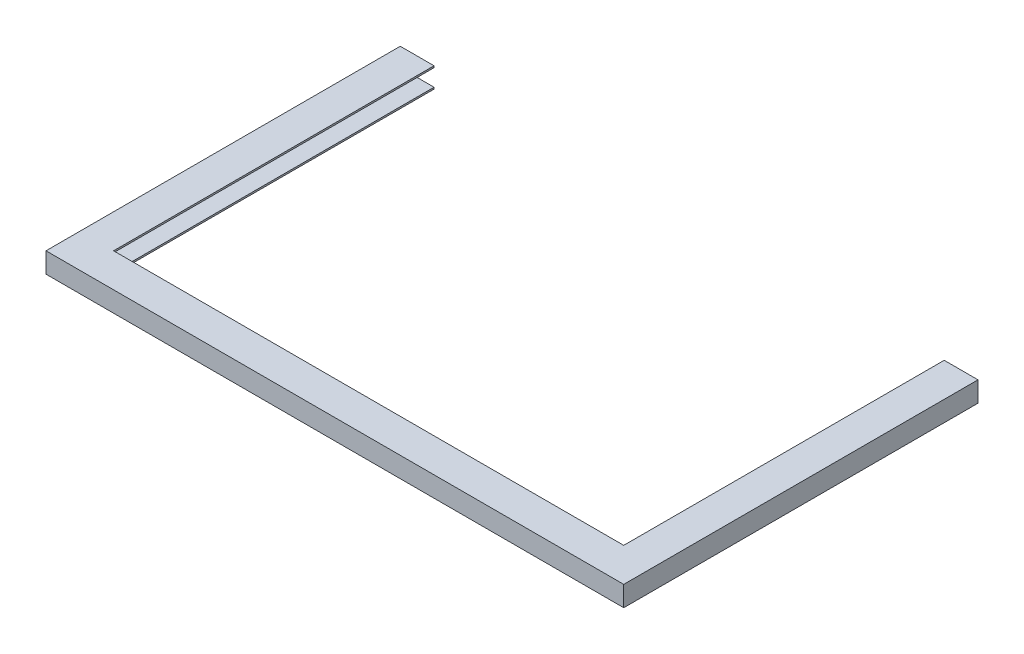
ISO-10303-21;
HEADER;
FILE_DESCRIPTION(('STEP AP214'),'2;1');
FILE_NAME('part.step','',(''),(''),'','','');
FILE_SCHEMA(('AUTOMOTIVE_DESIGN { 1 0 10303 214 1 1 1 1 }'));
ENDSEC;
DATA;
#1=APPLICATION_CONTEXT('core data for automotive mechanical design processes');
#2=APPLICATION_PROTOCOL_DEFINITION('international standard','automotive_design',2000,#1);
#3=PRODUCT_CONTEXT('',#1,'mechanical');
#4=PRODUCT('Part','Part','',(#3));
#5=PRODUCT_RELATED_PRODUCT_CATEGORY('part','',(#4));
#6=PRODUCT_DEFINITION_FORMATION('','',#4);
#7=PRODUCT_DEFINITION_CONTEXT('part definition',#1,'design');
#8=PRODUCT_DEFINITION('design','',#6,#7);
#9=PRODUCT_DEFINITION_SHAPE('','',#8);
#10=(LENGTH_UNIT() NAMED_UNIT(*) SI_UNIT(.MILLI.,.METRE.));
#11=(NAMED_UNIT(*) PLANE_ANGLE_UNIT() SI_UNIT($,.RADIAN.));
#12=(NAMED_UNIT(*) SI_UNIT($,.STERADIAN.) SOLID_ANGLE_UNIT());
#13=UNCERTAINTY_MEASURE_WITH_UNIT(LENGTH_MEASURE(1.E-05),#10,'distance_accuracy_value','');
#14=(GEOMETRIC_REPRESENTATION_CONTEXT(3) GLOBAL_UNCERTAINTY_ASSIGNED_CONTEXT((#13)) GLOBAL_UNIT_ASSIGNED_CONTEXT((#10,
#11,#12)) REPRESENTATION_CONTEXT('',''));
#15=CARTESIAN_POINT('',(0.,0.,0.));
#16=DIRECTION('',(0.,0.,1.));
#17=DIRECTION('',(1.,0.,0.));
#18=AXIS2_PLACEMENT_3D('',#15,#16,#17);
#19=CARTESIAN_POINT('',(0.,12.,-199.71239488283));
#20=DIRECTION('',(0.,0.,-1.));
#21=DIRECTION('',(-1.,0.,0.));
#22=AXIS2_PLACEMENT_3D('',#19,#20,#21);
#23=PLANE('',#22);
#24=DIRECTION('',(0.,1.,0.));
#25=VECTOR('',#24,1.);
#26=CARTESIAN_POINT('',(170.,0.999999999999971,-199.71239488283));
#27=LINE('',#26,#25);
#28=CARTESIAN_POINT('',(170.,0.999999999999971,-199.71239488283));
#29=VERTEX_POINT('',#28);
#30=CARTESIAN_POINT('',(170.,11.,-199.71239488283));
#31=VERTEX_POINT('',#30);
#32=EDGE_CURVE('E254',#29,#31,#27,.T.);
#33=ORIENTED_EDGE('',*,*,#32,.T.);
#34=DIRECTION('',(-1.,0.,0.));
#35=VECTOR('',#34,1.);
#36=CARTESIAN_POINT('',(170.,11.,-199.71239488283));
#37=LINE('',#36,#35);
#38=CARTESIAN_POINT('',(151.,11.,-199.71239488283));
#39=VERTEX_POINT('',#38);
#40=EDGE_CURVE('E252',#31,#39,#37,.T.);
#41=ORIENTED_EDGE('',*,*,#40,.T.);
#42=DIRECTION('',(0.,-1.,0.));
#43=VECTOR('',#42,1.);
#44=CARTESIAN_POINT('',(151.,12.,-199.71239488283));
#45=LINE('',#44,#43);
#46=CARTESIAN_POINT('',(151.,12.,-199.71239488283));
#47=VERTEX_POINT('',#46);
#48=EDGE_CURVE('E182',#47,#39,#45,.T.);
#49=ORIENTED_EDGE('',*,*,#48,.F.);
#50=DIRECTION('',(1.,0.,0.));
#51=VECTOR('',#50,1.);
#52=CARTESIAN_POINT('',(0.,12.,-199.71239488283));
#53=LINE('',#52,#51);
#54=CARTESIAN_POINT('',(171.,12.,-199.71239488283));
#55=VERTEX_POINT('',#54);
#56=EDGE_CURVE('E217',#47,#55,#53,.T.);
#57=ORIENTED_EDGE('',*,*,#56,.T.);
#58=DIRECTION('',(0.,-1.,0.));
#59=VECTOR('',#58,1.);
#60=CARTESIAN_POINT('',(171.,12.,-199.71239488283));
#61=LINE('',#60,#59);
#62=CARTESIAN_POINT('',(171.,0.,-199.71239488283));
#63=VERTEX_POINT('',#62);
#64=EDGE_CURVE('E185',#55,#63,#61,.T.);
#65=ORIENTED_EDGE('',*,*,#64,.T.);
#66=DIRECTION('',(1.,0.,0.));
#67=VECTOR('',#66,1.);
#68=CARTESIAN_POINT('',(0.,0.,-199.71239488283));
#69=LINE('',#68,#67);
#70=CARTESIAN_POINT('',(151.,0.,-199.71239488283));
#71=VERTEX_POINT('',#70);
#72=EDGE_CURVE('E155',#71,#63,#69,.T.);
#73=ORIENTED_EDGE('',*,*,#72,.F.);
#74=CARTESIAN_POINT('',(151.,0.999999999999971,-199.71239488283));
#75=VERTEX_POINT('',#74);
#76=EDGE_CURVE('E181',#75,#71,#45,.T.);
#77=ORIENTED_EDGE('',*,*,#76,.F.);
#78=DIRECTION('',(-1.,0.,0.));
#79=VECTOR('',#78,1.);
#80=CARTESIAN_POINT('',(170.,0.999999999999971,-199.71239488283));
#81=LINE('',#80,#79);
#82=EDGE_CURVE('E247',#29,#75,#81,.T.);
#83=ORIENTED_EDGE('',*,*,#82,.F.);
#84=EDGE_LOOP('',(#33,#41,#49,#57,#65,#73,#77,#83));
#85=FACE_BOUND('',#84,.T.);
#86=ADVANCED_FACE('F33',(#85),#23,.T.);
#87=CARTESIAN_POINT('',(151.,12.,0.));
#88=DIRECTION('',(1.,0.,0.));
#89=DIRECTION('',(0.,0.,-1.));
#90=AXIS2_PLACEMENT_3D('',#87,#88,#89);
#91=PLANE('',#90);
#92=DIRECTION('',(0.,0.,-1.));
#93=VECTOR('',#92,1.);
#94=CARTESIAN_POINT('',(151.,11.,0.));
#95=LINE('',#94,#93);
#96=CARTESIAN_POINT('',(151.,11.,-10.));
#97=VERTEX_POINT('',#96);
#98=EDGE_CURVE('E152',#97,#39,#95,.T.);
#99=ORIENTED_EDGE('',*,*,#98,.F.);
#100=DIRECTION('',(0.,-1.,0.));
#101=VECTOR('',#100,1.);
#102=CARTESIAN_POINT('',(151.,12.,-10.));
#103=LINE('',#102,#101);
#104=CARTESIAN_POINT('',(151.,12.,-10.));
#105=VERTEX_POINT('',#104);
#106=EDGE_CURVE('E178',#105,#97,#103,.T.);
#107=ORIENTED_EDGE('',*,*,#106,.F.);
#108=DIRECTION('',(0.,0.,1.));
#109=VECTOR('',#108,1.);
#110=CARTESIAN_POINT('',(151.,12.,0.));
#111=LINE('',#110,#109);
#112=EDGE_CURVE('E144',#47,#105,#111,.T.);
#113=ORIENTED_EDGE('',*,*,#112,.F.);
#114=ORIENTED_EDGE('',*,*,#48,.T.);
#115=EDGE_LOOP('',(#99,#107,#113,#114));
#116=FACE_BOUND('',#115,.T.);
#117=ADVANCED_FACE('F292',(#116),#91,.F.);
#118=CARTESIAN_POINT('',(0.,12.,-10.));
#119=DIRECTION('',(0.,0.,-1.));
#120=DIRECTION('',(-1.,0.,0.));
#121=AXIS2_PLACEMENT_3D('',#118,#119,#120);
#122=PLANE('',#121);
#123=ORIENTED_EDGE('',*,*,#106,.T.);
#124=DIRECTION('',(-1.,0.,0.));
#125=VECTOR('',#124,1.);
#126=CARTESIAN_POINT('',(0.,11.,-10.));
#127=LINE('',#126,#125);
#128=CARTESIAN_POINT('',(-151.,11.,-10.));
#129=VERTEX_POINT('',#128);
#130=EDGE_CURVE('E225',#97,#129,#127,.T.);
#131=ORIENTED_EDGE('',*,*,#130,.T.);
#132=DIRECTION('',(0.,-1.,0.));
#133=VECTOR('',#132,1.);
#134=CARTESIAN_POINT('',(-151.,12.,-10.));
#135=LINE('',#134,#133);
#136=CARTESIAN_POINT('',(-151.,12.,-10.));
#137=VERTEX_POINT('',#136);
#138=EDGE_CURVE('E175',#137,#129,#135,.T.);
#139=ORIENTED_EDGE('',*,*,#138,.F.);
#140=DIRECTION('',(1.,0.,0.));
#141=VECTOR('',#140,1.);
#142=CARTESIAN_POINT('',(0.,12.,-10.));
#143=LINE('',#142,#141);
#144=EDGE_CURVE('E142',#137,#105,#143,.T.);
#145=ORIENTED_EDGE('',*,*,#144,.T.);
#146=EDGE_LOOP('',(#123,#131,#139,#145));
#147=FACE_BOUND('',#146,.T.);
#148=ADVANCED_FACE('F295',(#147),#122,.T.);
#149=CARTESIAN_POINT('',(-151.,12.,0.));
#150=DIRECTION('',(1.,0.,0.));
#151=DIRECTION('',(0.,0.,-1.));
#152=AXIS2_PLACEMENT_3D('',#149,#150,#151);
#153=PLANE('',#152);
#154=ORIENTED_EDGE('',*,*,#138,.T.);
#155=DIRECTION('',(0.,0.,-1.));
#156=VECTOR('',#155,1.);
#157=CARTESIAN_POINT('',(-151.,11.,0.));
#158=LINE('',#157,#156);
#159=CARTESIAN_POINT('',(-151.,11.,-199.71239488283));
#160=VERTEX_POINT('',#159);
#161=EDGE_CURVE('E124',#129,#160,#158,.T.);
#162=ORIENTED_EDGE('',*,*,#161,.T.);
#163=DIRECTION('',(0.,-1.,0.));
#164=VECTOR('',#163,1.);
#165=CARTESIAN_POINT('',(-151.,12.,-199.71239488283));
#166=LINE('',#165,#164);
#167=CARTESIAN_POINT('',(-151.,12.,-199.71239488283));
#168=VERTEX_POINT('',#167);
#169=EDGE_CURVE('E116',#168,#160,#166,.T.);
#170=ORIENTED_EDGE('',*,*,#169,.F.);
#171=DIRECTION('',(0.,0.,1.));
#172=VECTOR('',#171,1.);
#173=CARTESIAN_POINT('',(-151.,12.,0.));
#174=LINE('',#173,#172);
#175=EDGE_CURVE('E121',#168,#137,#174,.T.);
#176=ORIENTED_EDGE('',*,*,#175,.T.);
#177=EDGE_LOOP('',(#154,#162,#170,#176));
#178=FACE_BOUND('',#177,.T.);
#179=ADVANCED_FACE('F119',(#178),#153,.T.);
#180=CARTESIAN_POINT('',(0.,12.,-199.71239488283));
#181=DIRECTION('',(0.,0.,1.));
#182=DIRECTION('',(1.,0.,0.));
#183=AXIS2_PLACEMENT_3D('',#180,#181,#182);
#184=PLANE('',#183);
#185=DIRECTION('',(1.,0.,0.));
#186=VECTOR('',#185,1.);
#187=CARTESIAN_POINT('',(0.,11.,-199.71239488283));
#188=LINE('',#187,#186);
#189=CARTESIAN_POINT('',(-170.,11.,-199.71239488283));
#190=VERTEX_POINT('',#189);
#191=EDGE_CURVE('E11',#190,#160,#188,.T.);
#192=ORIENTED_EDGE('',*,*,#191,.F.);
#193=DIRECTION('',(0.,1.,0.));
#194=VECTOR('',#193,1.);
#195=CARTESIAN_POINT('',(-170.,0.999999999999971,-199.71239488283));
#196=LINE('',#195,#194);
#197=CARTESIAN_POINT('',(-170.,0.999999999999971,-199.71239488283));
#198=VERTEX_POINT('',#197);
#199=EDGE_CURVE('E193',#198,#190,#196,.T.);
#200=ORIENTED_EDGE('',*,*,#199,.F.);
#201=DIRECTION('',(1.,0.,0.));
#202=VECTOR('',#201,1.);
#203=CARTESIAN_POINT('',(0.,0.999999999999971,-199.71239488283));
#204=LINE('',#203,#202);
#205=CARTESIAN_POINT('',(-151.,0.999999999999971,-199.71239488283));
#206=VERTEX_POINT('',#205);
#207=EDGE_CURVE('E41',#198,#206,#204,.T.);
#208=ORIENTED_EDGE('',*,*,#207,.T.);
#209=CARTESIAN_POINT('',(-151.,0.,-199.71239488283));
#210=VERTEX_POINT('',#209);
#211=EDGE_CURVE('E128',#206,#210,#166,.T.);
#212=ORIENTED_EDGE('',*,*,#211,.T.);
#213=DIRECTION('',(-1.,0.,0.));
#214=VECTOR('',#213,1.);
#215=CARTESIAN_POINT('',(0.,0.,-199.71239488283));
#216=LINE('',#215,#214);
#217=CARTESIAN_POINT('',(-171.,0.,-199.71239488283));
#218=VERTEX_POINT('',#217);
#219=EDGE_CURVE('E167',#210,#218,#216,.T.);
#220=ORIENTED_EDGE('',*,*,#219,.T.);
#221=DIRECTION('',(0.,-1.,0.));
#222=VECTOR('',#221,1.);
#223=CARTESIAN_POINT('',(-171.,12.,-199.71239488283));
#224=LINE('',#223,#222);
#225=CARTESIAN_POINT('',(-171.,12.,-199.71239488283));
#226=VERTEX_POINT('',#225);
#227=EDGE_CURVE('E134',#226,#218,#224,.T.);
#228=ORIENTED_EDGE('',*,*,#227,.F.);
#229=DIRECTION('',(-1.,0.,0.));
#230=VECTOR('',#229,1.);
#231=CARTESIAN_POINT('',(0.,12.,-199.71239488283));
#232=LINE('',#231,#230);
#233=EDGE_CURVE('E131',#168,#226,#232,.T.);
#234=ORIENTED_EDGE('',*,*,#233,.F.);
#235=ORIENTED_EDGE('',*,*,#169,.T.);
#236=EDGE_LOOP('',(#192,#200,#208,#212,#220,#228,#234,#235));
#237=FACE_BOUND('',#236,.T.);
#238=ADVANCED_FACE('F132',(#237),#184,.F.);
#239=CARTESIAN_POINT('',(0.,12.,10.));
#240=DIRECTION('',(0.,0.,-1.));
#241=DIRECTION('',(-1.,0.,0.));
#242=AXIS2_PLACEMENT_3D('',#239,#240,#241);
#243=PLANE('',#242);
#244=DIRECTION('',(1.,0.,0.));
#245=VECTOR('',#244,1.);
#246=CARTESIAN_POINT('',(0.,0.,10.));
#247=LINE('',#246,#245);
#248=CARTESIAN_POINT('',(-171.,0.,10.));
#249=VERTEX_POINT('',#248);
#250=CARTESIAN_POINT('',(171.,0.,10.));
#251=VERTEX_POINT('',#250);
#252=EDGE_CURVE('E149',#249,#251,#247,.T.);
#253=ORIENTED_EDGE('',*,*,#252,.T.);
#254=DIRECTION('',(0.,-1.,0.));
#255=VECTOR('',#254,1.);
#256=CARTESIAN_POINT('',(171.,12.,10.));
#257=LINE('',#256,#255);
#258=CARTESIAN_POINT('',(171.,12.,10.));
#259=VERTEX_POINT('',#258);
#260=EDGE_CURVE('E187',#259,#251,#257,.T.);
#261=ORIENTED_EDGE('',*,*,#260,.F.);
#262=DIRECTION('',(1.,0.,0.));
#263=VECTOR('',#262,1.);
#264=CARTESIAN_POINT('',(0.,12.,10.));
#265=LINE('',#264,#263);
#266=CARTESIAN_POINT('',(-171.,12.,10.));
#267=VERTEX_POINT('',#266);
#268=EDGE_CURVE('E172',#267,#259,#265,.T.);
#269=ORIENTED_EDGE('',*,*,#268,.F.);
#270=DIRECTION('',(0.,-1.,0.));
#271=VECTOR('',#270,1.);
#272=CARTESIAN_POINT('',(-171.,12.,10.));
#273=LINE('',#272,#271);
#274=EDGE_CURVE('E57',#267,#249,#273,.T.);
#275=ORIENTED_EDGE('',*,*,#274,.T.);
#276=EDGE_LOOP('',(#253,#261,#269,#275));
#277=FACE_BOUND('',#276,.T.);
#278=ADVANCED_FACE('F35',(#277),#243,.F.);
#279=CARTESIAN_POINT('',(171.,12.,0.));
#280=DIRECTION('',(-1.,0.,0.));
#281=DIRECTION('',(0.,0.,1.));
#282=AXIS2_PLACEMENT_3D('',#279,#280,#281);
#283=PLANE('',#282);
#284=DIRECTION('',(0.,0.,-1.));
#285=VECTOR('',#284,1.);
#286=CARTESIAN_POINT('',(171.,0.,0.));
#287=LINE('',#286,#285);
#288=EDGE_CURVE('E151',#251,#63,#287,.T.);
#289=ORIENTED_EDGE('',*,*,#288,.T.);
#290=ORIENTED_EDGE('',*,*,#64,.F.);
#291=DIRECTION('',(0.,0.,-1.));
#292=VECTOR('',#291,1.);
#293=CARTESIAN_POINT('',(171.,12.,0.));
#294=LINE('',#293,#292);
#295=EDGE_CURVE('E97',#259,#55,#294,.T.);
#296=ORIENTED_EDGE('',*,*,#295,.F.);
#297=ORIENTED_EDGE('',*,*,#260,.T.);
#298=EDGE_LOOP('',(#289,#290,#296,#297));
#299=FACE_BOUND('',#298,.T.);
#300=ADVANCED_FACE('F209',(#299),#283,.F.);
#301=CARTESIAN_POINT('',(151.,0.999999999999971,-10.));
#302=VERTEX_POINT('',#301);
#303=CARTESIAN_POINT('',(151.,0.,-10.));
#304=VERTEX_POINT('',#303);
#305=EDGE_CURVE('E177',#302,#304,#103,.T.);
#306=ORIENTED_EDGE('',*,*,#305,.F.);
#307=DIRECTION('',(0.,0.,-1.));
#308=VECTOR('',#307,1.);
#309=CARTESIAN_POINT('',(151.,0.999999999999971,0.));
#310=LINE('',#309,#308);
#311=EDGE_CURVE('E229',#302,#75,#310,.T.);
#312=ORIENTED_EDGE('',*,*,#311,.T.);
#313=ORIENTED_EDGE('',*,*,#76,.T.);
#314=DIRECTION('',(0.,0.,1.));
#315=VECTOR('',#314,1.);
#316=CARTESIAN_POINT('',(151.,0.,0.));
#317=LINE('',#316,#315);
#318=EDGE_CURVE('E158',#71,#304,#317,.T.);
#319=ORIENTED_EDGE('',*,*,#318,.T.);
#320=EDGE_LOOP('',(#306,#312,#313,#319));
#321=FACE_BOUND('',#320,.T.);
#322=ADVANCED_FACE('F327',(#321),#91,.F.);
#323=DIRECTION('',(-1.,0.,0.));
#324=VECTOR('',#323,1.);
#325=CARTESIAN_POINT('',(0.,0.999999999999971,-10.));
#326=LINE('',#325,#324);
#327=CARTESIAN_POINT('',(-151.,0.999999999999971,-10.));
#328=VERTEX_POINT('',#327);
#329=EDGE_CURVE('E232',#302,#328,#326,.T.);
#330=ORIENTED_EDGE('',*,*,#329,.F.);
#331=ORIENTED_EDGE('',*,*,#305,.T.);
#332=DIRECTION('',(1.,0.,0.));
#333=VECTOR('',#332,1.);
#334=CARTESIAN_POINT('',(0.,0.,-10.));
#335=LINE('',#334,#333);
#336=CARTESIAN_POINT('',(-151.,0.,-10.));
#337=VERTEX_POINT('',#336);
#338=EDGE_CURVE('E161',#337,#304,#335,.T.);
#339=ORIENTED_EDGE('',*,*,#338,.F.);
#340=EDGE_CURVE('E127',#328,#337,#135,.T.);
#341=ORIENTED_EDGE('',*,*,#340,.F.);
#342=EDGE_LOOP('',(#330,#331,#339,#341));
#343=FACE_BOUND('',#342,.T.);
#344=ADVANCED_FACE('F334',(#343),#122,.T.);
#345=DIRECTION('',(0.,0.,-1.));
#346=VECTOR('',#345,1.);
#347=CARTESIAN_POINT('',(-151.,0.999999999999971,0.));
#348=LINE('',#347,#346);
#349=EDGE_CURVE('E48',#328,#206,#348,.T.);
#350=ORIENTED_EDGE('',*,*,#349,.F.);
#351=ORIENTED_EDGE('',*,*,#340,.T.);
#352=DIRECTION('',(0.,0.,1.));
#353=VECTOR('',#352,1.);
#354=CARTESIAN_POINT('',(-151.,0.,0.));
#355=LINE('',#354,#353);
#356=EDGE_CURVE('E164',#210,#337,#355,.T.);
#357=ORIENTED_EDGE('',*,*,#356,.F.);
#358=ORIENTED_EDGE('',*,*,#211,.F.);
#359=EDGE_LOOP('',(#350,#351,#357,#358));
#360=FACE_BOUND('',#359,.T.);
#361=ADVANCED_FACE('F198',(#360),#153,.T.);
#362=CARTESIAN_POINT('',(-171.,12.,0.));
#363=DIRECTION('',(-1.,0.,0.));
#364=DIRECTION('',(0.,0.,1.));
#365=AXIS2_PLACEMENT_3D('',#362,#363,#364);
#366=PLANE('',#365);
#367=DIRECTION('',(0.,0.,-1.));
#368=VECTOR('',#367,1.);
#369=CARTESIAN_POINT('',(-171.,0.,0.));
#370=LINE('',#369,#368);
#371=EDGE_CURVE('E169',#249,#218,#370,.T.);
#372=ORIENTED_EDGE('',*,*,#371,.F.);
#373=ORIENTED_EDGE('',*,*,#274,.F.);
#374=DIRECTION('',(0.,0.,-1.));
#375=VECTOR('',#374,1.);
#376=CARTESIAN_POINT('',(-171.,12.,0.));
#377=LINE('',#376,#375);
#378=EDGE_CURVE('E137',#267,#226,#377,.T.);
#379=ORIENTED_EDGE('',*,*,#378,.T.);
#380=ORIENTED_EDGE('',*,*,#227,.T.);
#381=EDGE_LOOP('',(#372,#373,#379,#380));
#382=FACE_BOUND('',#381,.T.);
#383=ADVANCED_FACE('F205',(#382),#366,.T.);
#384=CARTESIAN_POINT('',(0.,12.,0.));
#385=DIRECTION('',(0.,1.,0.));
#386=DIRECTION('',(0.,0.,1.));
#387=AXIS2_PLACEMENT_3D('',#384,#385,#386);
#388=PLANE('',#387);
#389=ORIENTED_EDGE('',*,*,#268,.T.);
#390=ORIENTED_EDGE('',*,*,#295,.T.);
#391=ORIENTED_EDGE('',*,*,#56,.F.);
#392=ORIENTED_EDGE('',*,*,#112,.T.);
#393=ORIENTED_EDGE('',*,*,#144,.F.);
#394=ORIENTED_EDGE('',*,*,#175,.F.);
#395=ORIENTED_EDGE('',*,*,#233,.T.);
#396=ORIENTED_EDGE('',*,*,#378,.F.);
#397=EDGE_LOOP('',(#389,#390,#391,#392,#393,#394,#395,#396));
#398=FACE_BOUND('',#397,.T.);
#399=ADVANCED_FACE('F140',(#398),#388,.T.);
#400=CARTESIAN_POINT('',(0.,0.,0.));
#401=DIRECTION('',(0.,1.,0.));
#402=DIRECTION('',(0.,0.,1.));
#403=AXIS2_PLACEMENT_3D('',#400,#401,#402);
#404=PLANE('',#403);
#405=ORIENTED_EDGE('',*,*,#252,.F.);
#406=ORIENTED_EDGE('',*,*,#371,.T.);
#407=ORIENTED_EDGE('',*,*,#219,.F.);
#408=ORIENTED_EDGE('',*,*,#356,.T.);
#409=ORIENTED_EDGE('',*,*,#338,.T.);
#410=ORIENTED_EDGE('',*,*,#318,.F.);
#411=ORIENTED_EDGE('',*,*,#72,.T.);
#412=ORIENTED_EDGE('',*,*,#288,.F.);
#413=EDGE_LOOP('',(#405,#406,#407,#408,#409,#410,#411,#412));
#414=FACE_BOUND('',#413,.T.);
#415=ADVANCED_FACE('F203',(#414),#404,.F.);
#416=CARTESIAN_POINT('',(170.,11.,8.28760511716956));
#417=DIRECTION('',(0.,-1.,0.));
#418=DIRECTION('',(0.,0.,-1.));
#419=AXIS2_PLACEMENT_3D('',#416,#417,#418);
#420=PLANE('',#419);
#421=ORIENTED_EDGE('',*,*,#98,.T.);
#422=ORIENTED_EDGE('',*,*,#40,.F.);
#423=DIRECTION('',(0.,0.,-1.));
#424=VECTOR('',#423,1.);
#425=CARTESIAN_POINT('',(170.,11.,8.28760511716956));
#426=LINE('',#425,#424);
#427=CARTESIAN_POINT('',(170.,11.,8.28760511716956));
#428=VERTEX_POINT('',#427);
#429=EDGE_CURVE('E235',#428,#31,#426,.T.);
#430=ORIENTED_EDGE('',*,*,#429,.F.);
#431=DIRECTION('',(-1.,0.,0.));
#432=VECTOR('',#431,1.);
#433=CARTESIAN_POINT('',(170.,11.,8.28760511716956));
#434=LINE('',#433,#432);
#435=CARTESIAN_POINT('',(-170.,11.,8.28760511716956));
#436=VERTEX_POINT('',#435);
#437=EDGE_CURVE('E261',#428,#436,#434,.T.);
#438=ORIENTED_EDGE('',*,*,#437,.T.);
#439=DIRECTION('',(0.,0.,-1.));
#440=VECTOR('',#439,1.);
#441=CARTESIAN_POINT('',(-170.,11.,8.28760511716956));
#442=LINE('',#441,#440);
#443=EDGE_CURVE('E238',#436,#190,#442,.T.);
#444=ORIENTED_EDGE('',*,*,#443,.T.);
#445=ORIENTED_EDGE('',*,*,#191,.T.);
#446=ORIENTED_EDGE('',*,*,#161,.F.);
#447=ORIENTED_EDGE('',*,*,#130,.F.);
#448=EDGE_LOOP('',(#421,#422,#430,#438,#444,#445,#446,#447));
#449=FACE_BOUND('',#448,.T.);
#450=ADVANCED_FACE('F282',(#449),#420,.T.);
#451=CARTESIAN_POINT('',(170.,0.999999999999971,8.28760511716956));
#452=DIRECTION('',(0.,-1.,0.));
#453=DIRECTION('',(0.,0.,-1.));
#454=AXIS2_PLACEMENT_3D('',#451,#452,#453);
#455=PLANE('',#454);
#456=ORIENTED_EDGE('',*,*,#329,.T.);
#457=ORIENTED_EDGE('',*,*,#349,.T.);
#458=ORIENTED_EDGE('',*,*,#207,.F.);
#459=DIRECTION('',(0.,0.,-1.));
#460=VECTOR('',#459,1.);
#461=CARTESIAN_POINT('',(-170.,0.999999999999971,8.28760511716956));
#462=LINE('',#461,#460);
#463=CARTESIAN_POINT('',(-170.,0.999999999999971,8.28760511716956));
#464=VERTEX_POINT('',#463);
#465=EDGE_CURVE('E241',#464,#198,#462,.T.);
#466=ORIENTED_EDGE('',*,*,#465,.F.);
#467=DIRECTION('',(-1.,0.,0.));
#468=VECTOR('',#467,1.);
#469=CARTESIAN_POINT('',(170.,0.999999999999971,8.28760511716956));
#470=LINE('',#469,#468);
#471=CARTESIAN_POINT('',(170.,0.999999999999971,8.28760511716956));
#472=VERTEX_POINT('',#471);
#473=EDGE_CURVE('E246',#472,#464,#470,.T.);
#474=ORIENTED_EDGE('',*,*,#473,.F.);
#475=DIRECTION('',(0.,0.,-1.));
#476=VECTOR('',#475,1.);
#477=CARTESIAN_POINT('',(170.,0.999999999999971,8.28760511716956));
#478=LINE('',#477,#476);
#479=EDGE_CURVE('E243',#472,#29,#478,.T.);
#480=ORIENTED_EDGE('',*,*,#479,.T.);
#481=ORIENTED_EDGE('',*,*,#82,.T.);
#482=ORIENTED_EDGE('',*,*,#311,.F.);
#483=EDGE_LOOP('',(#456,#457,#458,#466,#474,#480,#481,#482));
#484=FACE_BOUND('',#483,.T.);
#485=ADVANCED_FACE('F310',(#484),#455,.F.);
#486=CARTESIAN_POINT('',(170.,0.999999999999971,8.28760511716956));
#487=DIRECTION('',(-1.,0.,0.));
#488=DIRECTION('',(0.,0.,1.));
#489=AXIS2_PLACEMENT_3D('',#486,#487,#488);
#490=PLANE('',#489);
#491=ORIENTED_EDGE('',*,*,#32,.F.);
#492=ORIENTED_EDGE('',*,*,#479,.F.);
#493=DIRECTION('',(0.,1.,0.));
#494=VECTOR('',#493,1.);
#495=CARTESIAN_POINT('',(170.,0.999999999999971,8.28760511716956));
#496=LINE('',#495,#494);
#497=EDGE_CURVE('E250',#472,#428,#496,.T.);
#498=ORIENTED_EDGE('',*,*,#497,.T.);
#499=ORIENTED_EDGE('',*,*,#429,.T.);
#500=EDGE_LOOP('',(#491,#492,#498,#499));
#501=FACE_BOUND('',#500,.T.);
#502=ADVANCED_FACE('F271',(#501),#490,.T.);
#503=CARTESIAN_POINT('',(-170.,0.999999999999971,8.28760511716956));
#504=DIRECTION('',(-1.,0.,0.));
#505=DIRECTION('',(0.,0.,1.));
#506=AXIS2_PLACEMENT_3D('',#503,#504,#505);
#507=PLANE('',#506);
#508=ORIENTED_EDGE('',*,*,#199,.T.);
#509=ORIENTED_EDGE('',*,*,#443,.F.);
#510=DIRECTION('',(0.,1.,0.));
#511=VECTOR('',#510,1.);
#512=CARTESIAN_POINT('',(-170.,0.999999999999971,8.28760511716956));
#513=LINE('',#512,#511);
#514=EDGE_CURVE('E258',#464,#436,#513,.T.);
#515=ORIENTED_EDGE('',*,*,#514,.F.);
#516=ORIENTED_EDGE('',*,*,#465,.T.);
#517=EDGE_LOOP('',(#508,#509,#515,#516));
#518=FACE_BOUND('',#517,.T.);
#519=ADVANCED_FACE('F312',(#518),#507,.F.);
#520=CARTESIAN_POINT('',(0.,0.,8.28760511716956));
#521=DIRECTION('',(0.,0.,1.));
#522=DIRECTION('',(1.,0.,0.));
#523=AXIS2_PLACEMENT_3D('',#520,#521,#522);
#524=PLANE('',#523);
#525=ORIENTED_EDGE('',*,*,#497,.F.);
#526=ORIENTED_EDGE('',*,*,#473,.T.);
#527=ORIENTED_EDGE('',*,*,#514,.T.);
#528=ORIENTED_EDGE('',*,*,#437,.F.);
#529=EDGE_LOOP('',(#525,#526,#527,#528));
#530=FACE_BOUND('',#529,.T.);
#531=ADVANCED_FACE('F313',(#530),#524,.F.);
#532=CLOSED_SHELL('',(#86,#117,#148,#179,#238,#278,#300,#322,#344,#361,#383,#399,#415,#450,#485,
#502,#519,#531));
#533=MANIFOLD_SOLID_BREP('B2',#532);
#534=ADVANCED_BREP_SHAPE_REPRESENTATION('',(#18,#533),#14);
#535=SHAPE_DEFINITION_REPRESENTATION(#9,#534);
ENDSEC;
END-ISO-10303-21;
